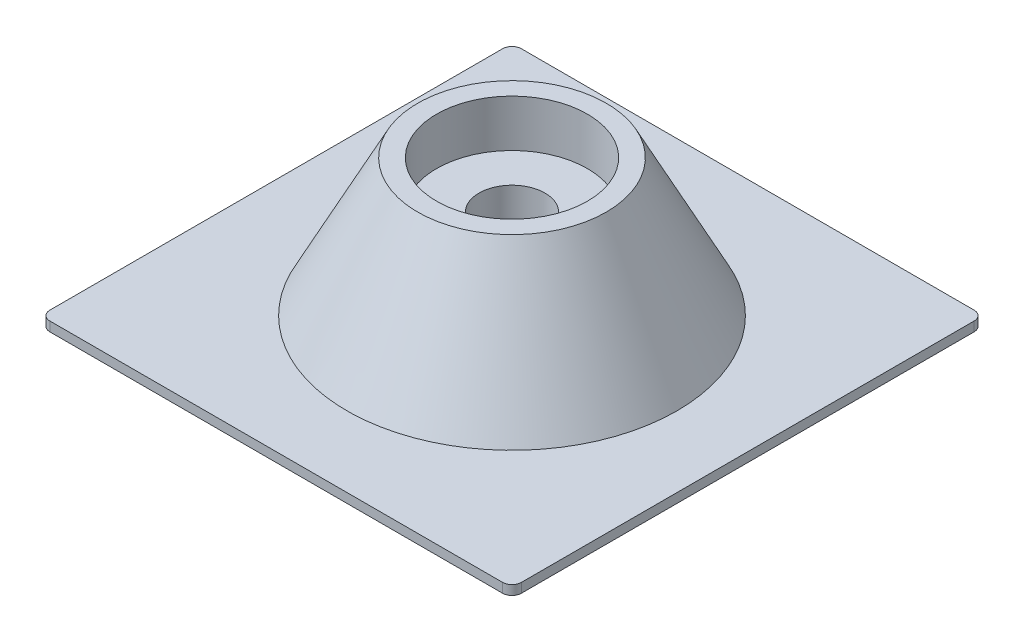
ISO-10303-21;
HEADER;
FILE_DESCRIPTION(('STEP AP214'),'2;1');
FILE_NAME('part.step','',(''),(''),'','','');
FILE_SCHEMA(('AUTOMOTIVE_DESIGN { 1 0 10303 214 1 1 1 1 }'));
ENDSEC;
DATA;
#1=APPLICATION_CONTEXT('core data for automotive mechanical design processes');
#2=APPLICATION_PROTOCOL_DEFINITION('international standard','automotive_design',2000,#1);
#3=PRODUCT_CONTEXT('',#1,'mechanical');
#4=PRODUCT('Part','Part','',(#3));
#5=PRODUCT_RELATED_PRODUCT_CATEGORY('part','',(#4));
#6=PRODUCT_DEFINITION_FORMATION('','',#4);
#7=PRODUCT_DEFINITION_CONTEXT('part definition',#1,'design');
#8=PRODUCT_DEFINITION('design','',#6,#7);
#9=PRODUCT_DEFINITION_SHAPE('','',#8);
#10=(LENGTH_UNIT() NAMED_UNIT(*) SI_UNIT(.MILLI.,.METRE.));
#11=(NAMED_UNIT(*) PLANE_ANGLE_UNIT() SI_UNIT($,.RADIAN.));
#12=(NAMED_UNIT(*) SI_UNIT($,.STERADIAN.) SOLID_ANGLE_UNIT());
#13=UNCERTAINTY_MEASURE_WITH_UNIT(LENGTH_MEASURE(1.E-05),#10,'distance_accuracy_value','');
#14=(GEOMETRIC_REPRESENTATION_CONTEXT(3) GLOBAL_UNCERTAINTY_ASSIGNED_CONTEXT((#13)) GLOBAL_UNIT_ASSIGNED_CONTEXT((#10,
#11,#12)) REPRESENTATION_CONTEXT('',''));
#15=CARTESIAN_POINT('',(0.,0.,0.));
#16=DIRECTION('',(0.,0.,1.));
#17=DIRECTION('',(1.,0.,0.));
#18=AXIS2_PLACEMENT_3D('',#15,#16,#17);
#19=CARTESIAN_POINT('',(24.,0.5,-24.));
#20=DIRECTION('',(0.,-1.,0.));
#21=DIRECTION('',(0.,0.,-1.));
#22=AXIS2_PLACEMENT_3D('',#19,#20,#21);
#23=PLANE('',#22);
#24=CARTESIAN_POINT('',(24.,0.5,-24.));
#25=DIRECTION('',(0.,1.,0.));
#26=DIRECTION('',(0.,0.,-1.));
#27=AXIS2_PLACEMENT_3D('',#24,#25,#26);
#28=CIRCLE('',#27,1.);
#29=CARTESIAN_POINT('',(25.,0.5,-24.));
#30=VERTEX_POINT('',#29);
#31=CARTESIAN_POINT('',(24.,0.5,-25.));
#32=VERTEX_POINT('',#31);
#33=EDGE_CURVE('E99',#30,#32,#28,.T.);
#34=ORIENTED_EDGE('',*,*,#33,.T.);
#35=DIRECTION('',(-1.,0.,0.));
#36=VECTOR('',#35,1.);
#37=CARTESIAN_POINT('',(-24.,0.5,-25.));
#38=LINE('',#37,#36);
#39=CARTESIAN_POINT('',(-24.,0.5,-25.));
#40=VERTEX_POINT('',#39);
#41=EDGE_CURVE('E107',#32,#40,#38,.T.);
#42=ORIENTED_EDGE('',*,*,#41,.T.);
#43=CARTESIAN_POINT('',(-24.,0.5,-24.));
#44=DIRECTION('',(0.,1.,0.));
#45=DIRECTION('',(0.,0.,1.));
#46=AXIS2_PLACEMENT_3D('',#43,#44,#45);
#47=CIRCLE('',#46,1.);
#48=CARTESIAN_POINT('',(-25.,0.5,-24.));
#49=VERTEX_POINT('',#48);
#50=EDGE_CURVE('E112',#40,#49,#47,.T.);
#51=ORIENTED_EDGE('',*,*,#50,.T.);
#52=DIRECTION('',(0.,0.,1.));
#53=VECTOR('',#52,1.);
#54=CARTESIAN_POINT('',(-25.,0.5,-24.));
#55=LINE('',#54,#53);
#56=CARTESIAN_POINT('',(-25.,0.5,24.));
#57=VERTEX_POINT('',#56);
#58=EDGE_CURVE('E126',#49,#57,#55,.T.);
#59=ORIENTED_EDGE('',*,*,#58,.T.);
#60=CARTESIAN_POINT('',(-24.,0.5,24.));
#61=DIRECTION('',(0.,1.,0.));
#62=DIRECTION('',(0.,0.,1.));
#63=AXIS2_PLACEMENT_3D('',#60,#61,#62);
#64=CIRCLE('',#63,1.);
#65=CARTESIAN_POINT('',(-24.,0.5,25.));
#66=VERTEX_POINT('',#65);
#67=EDGE_CURVE('E129',#57,#66,#64,.T.);
#68=ORIENTED_EDGE('',*,*,#67,.T.);
#69=DIRECTION('',(1.,0.,0.));
#70=VECTOR('',#69,1.);
#71=CARTESIAN_POINT('',(-24.,0.5,25.));
#72=LINE('',#71,#70);
#73=CARTESIAN_POINT('',(24.,0.5,25.));
#74=VERTEX_POINT('',#73);
#75=EDGE_CURVE('E132',#66,#74,#72,.T.);
#76=ORIENTED_EDGE('',*,*,#75,.T.);
#77=CARTESIAN_POINT('',(24.,0.5,24.));
#78=DIRECTION('',(0.,1.,0.));
#79=DIRECTION('',(0.,0.,1.));
#80=AXIS2_PLACEMENT_3D('',#77,#78,#79);
#81=CIRCLE('',#80,1.);
#82=CARTESIAN_POINT('',(25.,0.5,24.));
#83=VERTEX_POINT('',#82);
#84=EDGE_CURVE('E135',#74,#83,#81,.T.);
#85=ORIENTED_EDGE('',*,*,#84,.T.);
#86=DIRECTION('',(0.,0.,-1.));
#87=VECTOR('',#86,1.);
#88=CARTESIAN_POINT('',(25.,0.5,-24.));
#89=LINE('',#88,#87);
#90=EDGE_CURVE('E117',#83,#30,#89,.T.);
#91=ORIENTED_EDGE('',*,*,#90,.T.);
#92=EDGE_LOOP('',(#34,#42,#51,#59,#68,#76,#85,#91));
#93=FACE_BOUND('',#92,.T.);
#94=CARTESIAN_POINT('',(0.,0.5,0.));
#95=DIRECTION('',(0.,-1.,0.));
#96=DIRECTION('',(0.,0.,-1.));
#97=AXIS2_PLACEMENT_3D('',#94,#95,#96);
#98=CIRCLE('',#97,17.5);
#99=CARTESIAN_POINT('',(0.,0.5,-17.5));
#100=VERTEX_POINT('',#99);
#101=EDGE_CURVE('E11',#100,#100,#98,.F.);
#102=ORIENTED_EDGE('',*,*,#101,.F.);
#103=EDGE_LOOP('',(#102));
#104=FACE_BOUND('',#103,.T.);
#105=ADVANCED_FACE('F33',(#93,#104),#23,.F.);
#106=CARTESIAN_POINT('',(24.,-0.5,-24.));
#107=DIRECTION('',(0.,1.,0.));
#108=DIRECTION('',(0.,0.,1.));
#109=AXIS2_PLACEMENT_3D('',#106,#107,#108);
#110=CYLINDRICAL_SURFACE('',#109,1.);
#111=DIRECTION('',(0.,1.,0.));
#112=VECTOR('',#111,1.);
#113=CARTESIAN_POINT('',(24.,-0.5,-25.));
#114=LINE('',#113,#112);
#115=CARTESIAN_POINT('',(24.,-0.5,-25.));
#116=VERTEX_POINT('',#115);
#117=EDGE_CURVE('E96',#116,#32,#114,.T.);
#118=ORIENTED_EDGE('',*,*,#117,.T.);
#119=ORIENTED_EDGE('',*,*,#33,.F.);
#120=DIRECTION('',(0.,1.,0.));
#121=VECTOR('',#120,1.);
#122=CARTESIAN_POINT('',(25.,-0.5,-24.));
#123=LINE('',#122,#121);
#124=CARTESIAN_POINT('',(25.,-0.5,-24.));
#125=VERTEX_POINT('',#124);
#126=EDGE_CURVE('E41',#125,#30,#123,.T.);
#127=ORIENTED_EDGE('',*,*,#126,.F.);
#128=CARTESIAN_POINT('',(24.,-0.5,-24.));
#129=DIRECTION('',(0.,1.,0.));
#130=DIRECTION('',(0.,0.,-1.));
#131=AXIS2_PLACEMENT_3D('',#128,#129,#130);
#132=CIRCLE('',#131,1.);
#133=EDGE_CURVE('E100',#125,#116,#132,.T.);
#134=ORIENTED_EDGE('',*,*,#133,.T.);
#135=EDGE_LOOP('',(#118,#119,#127,#134));
#136=FACE_BOUND('',#135,.T.);
#137=ADVANCED_FACE('F35',(#136),#110,.T.);
#138=CARTESIAN_POINT('',(25.,-0.5,-24.));
#139=DIRECTION('',(1.,0.,0.));
#140=DIRECTION('',(0.,0.,-1.));
#141=AXIS2_PLACEMENT_3D('',#138,#139,#140);
#142=PLANE('',#141);
#143=ORIENTED_EDGE('',*,*,#126,.T.);
#144=ORIENTED_EDGE('',*,*,#90,.F.);
#145=DIRECTION('',(0.,1.,0.));
#146=VECTOR('',#145,1.);
#147=CARTESIAN_POINT('',(25.,-0.5,24.));
#148=LINE('',#147,#146);
#149=CARTESIAN_POINT('',(25.,-0.5,24.));
#150=VERTEX_POINT('',#149);
#151=EDGE_CURVE('E55',#150,#83,#148,.T.);
#152=ORIENTED_EDGE('',*,*,#151,.F.);
#153=DIRECTION('',(0.,0.,-1.));
#154=VECTOR('',#153,1.);
#155=CARTESIAN_POINT('',(25.,-0.5,-24.));
#156=LINE('',#155,#154);
#157=EDGE_CURVE('E105',#150,#125,#156,.T.);
#158=ORIENTED_EDGE('',*,*,#157,.T.);
#159=EDGE_LOOP('',(#143,#144,#152,#158));
#160=FACE_BOUND('',#159,.T.);
#161=ADVANCED_FACE('F191',(#160),#142,.T.);
#162=CARTESIAN_POINT('',(24.,-0.5,24.));
#163=DIRECTION('',(0.,1.,0.));
#164=DIRECTION('',(0.,0.,1.));
#165=AXIS2_PLACEMENT_3D('',#162,#163,#164);
#166=CYLINDRICAL_SURFACE('',#165,1.);
#167=ORIENTED_EDGE('',*,*,#151,.T.);
#168=ORIENTED_EDGE('',*,*,#84,.F.);
#169=DIRECTION('',(0.,1.,0.));
#170=VECTOR('',#169,1.);
#171=CARTESIAN_POINT('',(24.,-0.5,25.));
#172=LINE('',#171,#170);
#173=CARTESIAN_POINT('',(24.,-0.5,25.));
#174=VERTEX_POINT('',#173);
#175=EDGE_CURVE('E161',#174,#74,#172,.T.);
#176=ORIENTED_EDGE('',*,*,#175,.F.);
#177=CARTESIAN_POINT('',(24.,-0.5,24.));
#178=DIRECTION('',(0.,1.,0.));
#179=DIRECTION('',(0.,0.,1.));
#180=AXIS2_PLACEMENT_3D('',#177,#178,#179);
#181=CIRCLE('',#180,1.);
#182=EDGE_CURVE('E156',#174,#150,#181,.T.);
#183=ORIENTED_EDGE('',*,*,#182,.T.);
#184=EDGE_LOOP('',(#167,#168,#176,#183));
#185=FACE_BOUND('',#184,.T.);
#186=ADVANCED_FACE('F190',(#185),#166,.T.);
#187=CARTESIAN_POINT('',(-24.,-0.5,25.));
#188=DIRECTION('',(0.,0.,1.));
#189=DIRECTION('',(1.,0.,0.));
#190=AXIS2_PLACEMENT_3D('',#187,#188,#189);
#191=PLANE('',#190);
#192=ORIENTED_EDGE('',*,*,#175,.T.);
#193=ORIENTED_EDGE('',*,*,#75,.F.);
#194=DIRECTION('',(0.,1.,0.));
#195=VECTOR('',#194,1.);
#196=CARTESIAN_POINT('',(-24.,-0.5,25.));
#197=LINE('',#196,#195);
#198=CARTESIAN_POINT('',(-24.,-0.5,25.));
#199=VERTEX_POINT('',#198);
#200=EDGE_CURVE('E163',#199,#66,#197,.T.);
#201=ORIENTED_EDGE('',*,*,#200,.F.);
#202=DIRECTION('',(1.,0.,0.));
#203=VECTOR('',#202,1.);
#204=CARTESIAN_POINT('',(-24.,-0.5,25.));
#205=LINE('',#204,#203);
#206=EDGE_CURVE('E153',#199,#174,#205,.T.);
#207=ORIENTED_EDGE('',*,*,#206,.T.);
#208=EDGE_LOOP('',(#192,#193,#201,#207));
#209=FACE_BOUND('',#208,.T.);
#210=ADVANCED_FACE('F186',(#209),#191,.T.);
#211=CARTESIAN_POINT('',(-24.,-0.5,24.));
#212=DIRECTION('',(0.,1.,0.));
#213=DIRECTION('',(0.,0.,1.));
#214=AXIS2_PLACEMENT_3D('',#211,#212,#213);
#215=CYLINDRICAL_SURFACE('',#214,1.);
#216=ORIENTED_EDGE('',*,*,#200,.T.);
#217=ORIENTED_EDGE('',*,*,#67,.F.);
#218=DIRECTION('',(0.,1.,0.));
#219=VECTOR('',#218,1.);
#220=CARTESIAN_POINT('',(-25.,-0.5,24.));
#221=LINE('',#220,#219);
#222=CARTESIAN_POINT('',(-25.,-0.5,24.));
#223=VERTEX_POINT('',#222);
#224=EDGE_CURVE('E165',#223,#57,#221,.T.);
#225=ORIENTED_EDGE('',*,*,#224,.F.);
#226=CARTESIAN_POINT('',(-24.,-0.5,24.));
#227=DIRECTION('',(0.,1.,0.));
#228=DIRECTION('',(0.,0.,1.));
#229=AXIS2_PLACEMENT_3D('',#226,#227,#228);
#230=CIRCLE('',#229,1.);
#231=EDGE_CURVE('E150',#223,#199,#230,.T.);
#232=ORIENTED_EDGE('',*,*,#231,.T.);
#233=EDGE_LOOP('',(#216,#217,#225,#232));
#234=FACE_BOUND('',#233,.T.);
#235=ADVANCED_FACE('F179',(#234),#215,.T.);
#236=CARTESIAN_POINT('',(-25.,-0.5,-24.));
#237=DIRECTION('',(-1.,0.,0.));
#238=DIRECTION('',(0.,0.,1.));
#239=AXIS2_PLACEMENT_3D('',#236,#237,#238);
#240=PLANE('',#239);
#241=ORIENTED_EDGE('',*,*,#224,.T.);
#242=ORIENTED_EDGE('',*,*,#58,.F.);
#243=DIRECTION('',(0.,1.,0.));
#244=VECTOR('',#243,1.);
#245=CARTESIAN_POINT('',(-25.,-0.5,-24.));
#246=LINE('',#245,#244);
#247=CARTESIAN_POINT('',(-25.,-0.5,-24.));
#248=VERTEX_POINT('',#247);
#249=EDGE_CURVE('E167',#248,#49,#246,.T.);
#250=ORIENTED_EDGE('',*,*,#249,.F.);
#251=DIRECTION('',(0.,0.,1.));
#252=VECTOR('',#251,1.);
#253=CARTESIAN_POINT('',(-25.,-0.5,-24.));
#254=LINE('',#253,#252);
#255=EDGE_CURVE('E147',#248,#223,#254,.T.);
#256=ORIENTED_EDGE('',*,*,#255,.T.);
#257=EDGE_LOOP('',(#241,#242,#250,#256));
#258=FACE_BOUND('',#257,.T.);
#259=ADVANCED_FACE('F176',(#258),#240,.T.);
#260=CARTESIAN_POINT('',(-24.,-0.5,-24.));
#261=DIRECTION('',(0.,1.,0.));
#262=DIRECTION('',(0.,0.,1.));
#263=AXIS2_PLACEMENT_3D('',#260,#261,#262);
#264=CYLINDRICAL_SURFACE('',#263,1.);
#265=ORIENTED_EDGE('',*,*,#249,.T.);
#266=ORIENTED_EDGE('',*,*,#50,.F.);
#267=DIRECTION('',(0.,1.,0.));
#268=VECTOR('',#267,1.);
#269=CARTESIAN_POINT('',(-24.,-0.5,-25.));
#270=LINE('',#269,#268);
#271=CARTESIAN_POINT('',(-24.,-0.5,-25.));
#272=VERTEX_POINT('',#271);
#273=EDGE_CURVE('E104',#272,#40,#270,.T.);
#274=ORIENTED_EDGE('',*,*,#273,.F.);
#275=CARTESIAN_POINT('',(-24.,-0.5,-24.));
#276=DIRECTION('',(0.,1.,0.));
#277=DIRECTION('',(0.,0.,1.));
#278=AXIS2_PLACEMENT_3D('',#275,#276,#277);
#279=CIRCLE('',#278,1.);
#280=EDGE_CURVE('E144',#272,#248,#279,.T.);
#281=ORIENTED_EDGE('',*,*,#280,.T.);
#282=EDGE_LOOP('',(#265,#266,#274,#281));
#283=FACE_BOUND('',#282,.T.);
#284=ADVANCED_FACE('F170',(#283),#264,.T.);
#285=CARTESIAN_POINT('',(-24.,-0.5,-25.));
#286=DIRECTION('',(0.,0.,-1.));
#287=DIRECTION('',(-1.,0.,0.));
#288=AXIS2_PLACEMENT_3D('',#285,#286,#287);
#289=PLANE('',#288);
#290=ORIENTED_EDGE('',*,*,#273,.T.);
#291=ORIENTED_EDGE('',*,*,#41,.F.);
#292=ORIENTED_EDGE('',*,*,#117,.F.);
#293=DIRECTION('',(-1.,0.,0.));
#294=VECTOR('',#293,1.);
#295=CARTESIAN_POINT('',(-24.,-0.5,-25.));
#296=LINE('',#295,#294);
#297=EDGE_CURVE('E142',#116,#272,#296,.T.);
#298=ORIENTED_EDGE('',*,*,#297,.T.);
#299=EDGE_LOOP('',(#290,#291,#292,#298));
#300=FACE_BOUND('',#299,.T.);
#301=ADVANCED_FACE('F108',(#300),#289,.T.);
#302=CARTESIAN_POINT('',(24.,-0.5,-24.));
#303=DIRECTION('',(0.,-1.,0.));
#304=DIRECTION('',(0.,0.,-1.));
#305=AXIS2_PLACEMENT_3D('',#302,#303,#304);
#306=PLANE('',#305);
#307=CARTESIAN_POINT('',(0.,-0.5,0.));
#308=DIRECTION('',(0.,1.,0.));
#309=DIRECTION('',(0.,0.,1.));
#310=AXIS2_PLACEMENT_3D('',#307,#308,#309);
#311=CIRCLE('',#310,3.5);
#312=CARTESIAN_POINT('',(0.,-0.5,3.5));
#313=VERTEX_POINT('',#312);
#314=EDGE_CURVE('E138',#313,#313,#311,.T.);
#315=ORIENTED_EDGE('',*,*,#314,.T.);
#316=EDGE_LOOP('',(#315));
#317=FACE_BOUND('',#316,.T.);
#318=ORIENTED_EDGE('',*,*,#133,.F.);
#319=ORIENTED_EDGE('',*,*,#157,.F.);
#320=ORIENTED_EDGE('',*,*,#182,.F.);
#321=ORIENTED_EDGE('',*,*,#206,.F.);
#322=ORIENTED_EDGE('',*,*,#231,.F.);
#323=ORIENTED_EDGE('',*,*,#255,.F.);
#324=ORIENTED_EDGE('',*,*,#280,.F.);
#325=ORIENTED_EDGE('',*,*,#297,.F.);
#326=EDGE_LOOP('',(#318,#319,#320,#321,#322,#323,#324,#325));
#327=FACE_BOUND('',#326,.T.);
#328=ADVANCED_FACE('F182',(#317,#327),#306,.T.);
#329=CARTESIAN_POINT('',(0.,-0.5,0.));
#330=DIRECTION('',(0.,1.,0.));
#331=DIRECTION('',(0.,0.,1.));
#332=AXIS2_PLACEMENT_3D('',#329,#330,#331);
#333=CYLINDRICAL_SURFACE('',#332,3.5);
#334=ORIENTED_EDGE('',*,*,#314,.F.);
#335=EDGE_LOOP('',(#334));
#336=FACE_BOUND('',#335,.T.);
#337=CARTESIAN_POINT('',(0.,10.,0.));
#338=DIRECTION('',(0.,-1.,0.));
#339=DIRECTION('',(1.,0.,0.));
#340=AXIS2_PLACEMENT_3D('',#337,#338,#339);
#341=CIRCLE('',#340,3.5);
#342=CARTESIAN_POINT('',(3.5,10.,0.));
#343=VERTEX_POINT('',#342);
#344=EDGE_CURVE('E220',#343,#343,#341,.T.);
#345=ORIENTED_EDGE('',*,*,#344,.F.);
#346=EDGE_LOOP('',(#345));
#347=FACE_BOUND('',#346,.T.);
#348=ADVANCED_FACE('F208',(#336,#347),#333,.F.);
#349=CARTESIAN_POINT('',(0.,0.5,0.));
#350=DIRECTION('',(0.,-1.,0.));
#351=DIRECTION('',(1.,0.,0.));
#352=AXIS2_PLACEMENT_3D('',#349,#350,#351);
#353=CYLINDRICAL_SURFACE('',#352,8.);
#354=CARTESIAN_POINT('',(0.,15.,0.));
#355=DIRECTION('',(0.,-1.,0.));
#356=DIRECTION('',(1.,0.,0.));
#357=AXIS2_PLACEMENT_3D('',#354,#355,#356);
#358=CIRCLE('',#357,8.);
#359=CARTESIAN_POINT('',(8.,15.,0.));
#360=VERTEX_POINT('',#359);
#361=EDGE_CURVE('E118',#360,#360,#358,.T.);
#362=ORIENTED_EDGE('',*,*,#361,.F.);
#363=EDGE_LOOP('',(#362));
#364=FACE_BOUND('',#363,.T.);
#365=CARTESIAN_POINT('',(0.,10.,0.));
#366=DIRECTION('',(0.,-1.,0.));
#367=DIRECTION('',(1.,0.,0.));
#368=AXIS2_PLACEMENT_3D('',#365,#366,#367);
#369=CIRCLE('',#368,8.);
#370=CARTESIAN_POINT('',(8.,10.,0.));
#371=VERTEX_POINT('',#370);
#372=EDGE_CURVE('E222',#371,#371,#369,.T.);
#373=ORIENTED_EDGE('',*,*,#372,.T.);
#374=EDGE_LOOP('',(#373));
#375=FACE_BOUND('',#374,.T.);
#376=ADVANCED_FACE('F206',(#364,#375),#353,.F.);
#377=CARTESIAN_POINT('',(-8.,15.,0.));
#378=DIRECTION('',(0.,-1.,0.));
#379=DIRECTION('',(1.,0.,0.));
#380=AXIS2_PLACEMENT_3D('',#377,#378,#379);
#381=PLANE('',#380);
#382=CARTESIAN_POINT('',(0.,15.,0.));
#383=DIRECTION('',(0.,-1.,0.));
#384=DIRECTION('',(1.,0.,0.));
#385=AXIS2_PLACEMENT_3D('',#382,#383,#384);
#386=CIRCLE('',#385,10.);
#387=CARTESIAN_POINT('',(10.,15.,0.));
#388=VERTEX_POINT('',#387);
#389=EDGE_CURVE('E121',#388,#388,#386,.T.);
#390=ORIENTED_EDGE('',*,*,#389,.F.);
#391=EDGE_LOOP('',(#390));
#392=FACE_BOUND('',#391,.T.);
#393=ORIENTED_EDGE('',*,*,#361,.T.);
#394=EDGE_LOOP('',(#393));
#395=FACE_BOUND('',#394,.T.);
#396=ADVANCED_FACE('F237',(#392,#395),#381,.F.);
#397=CARTESIAN_POINT('',(0.,15.,0.));
#398=DIRECTION('',(0.,-1.,0.));
#399=DIRECTION('',(1.,0.,0.));
#400=AXIS2_PLACEMENT_3D('',#397,#398,#399);
#401=CONICAL_SURFACE('',#400,10.,0.477345382373672);
#402=ORIENTED_EDGE('',*,*,#101,.T.);
#403=EDGE_LOOP('',(#402));
#404=FACE_BOUND('',#403,.T.);
#405=ORIENTED_EDGE('',*,*,#389,.T.);
#406=EDGE_LOOP('',(#405));
#407=FACE_BOUND('',#406,.T.);
#408=ADVANCED_FACE('F232',(#404,#407),#401,.T.);
#409=CARTESIAN_POINT('',(-8.,10.,0.));
#410=DIRECTION('',(0.,-1.,0.));
#411=DIRECTION('',(1.,0.,0.));
#412=AXIS2_PLACEMENT_3D('',#409,#410,#411);
#413=PLANE('',#412);
#414=ORIENTED_EDGE('',*,*,#372,.F.);
#415=EDGE_LOOP('',(#414));
#416=FACE_BOUND('',#415,.T.);
#417=ORIENTED_EDGE('',*,*,#344,.T.);
#418=EDGE_LOOP('',(#417));
#419=FACE_BOUND('',#418,.T.);
#420=ADVANCED_FACE('F230',(#416,#419),#413,.F.);
#421=CLOSED_SHELL('',(#105,#137,#161,#186,#210,#235,#259,#284,#301,#328,#348,#376,#396,#408,#420));
#422=MANIFOLD_SOLID_BREP('B2',#421);
#423=ADVANCED_BREP_SHAPE_REPRESENTATION('',(#18,#422),#14);
#424=SHAPE_DEFINITION_REPRESENTATION(#9,#423);
ENDSEC;
END-ISO-10303-21;
